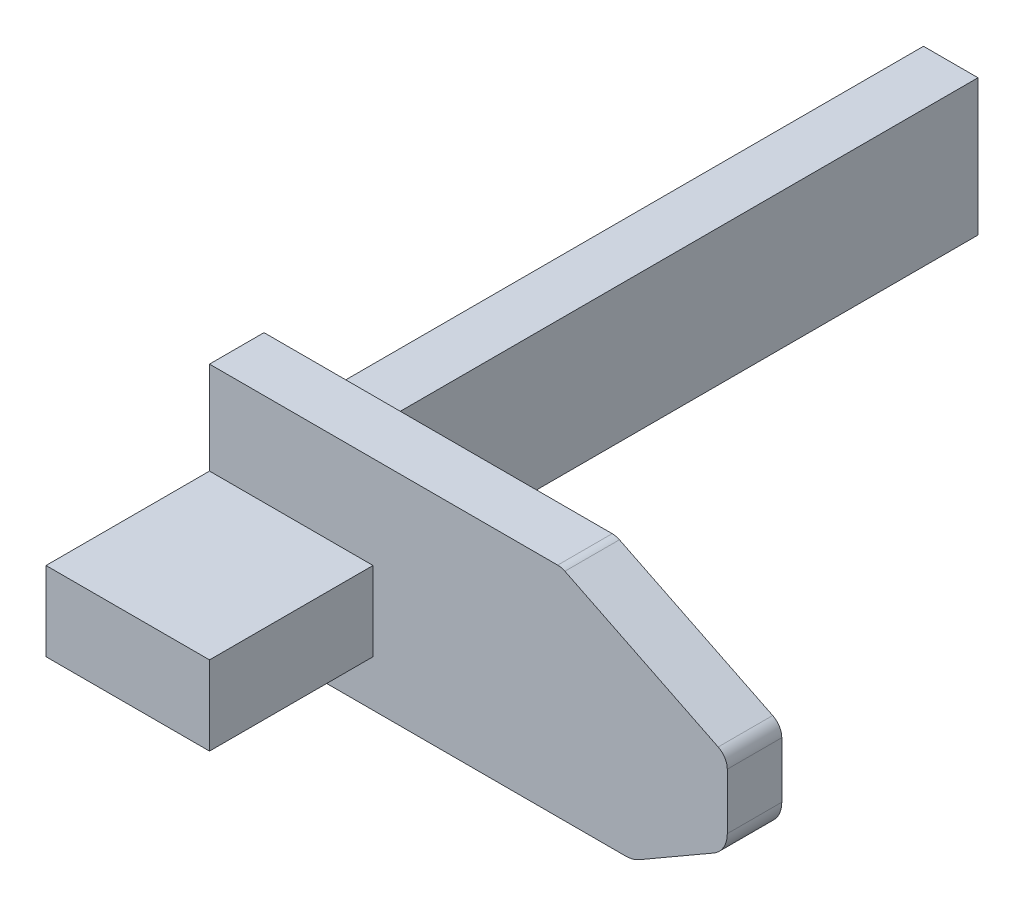
ISO-10303-21;
HEADER;
FILE_DESCRIPTION(('STEP AP214'),'2;1');
FILE_NAME('part.step','',(''),(''),'','','');
FILE_SCHEMA(('AUTOMOTIVE_DESIGN { 1 0 10303 214 1 1 1 1 }'));
ENDSEC;
DATA;
#1=APPLICATION_CONTEXT('core data for automotive mechanical design processes');
#2=APPLICATION_PROTOCOL_DEFINITION('international standard','automotive_design',2000,#1);
#3=PRODUCT_CONTEXT('',#1,'mechanical');
#4=PRODUCT('Part','Part','',(#3));
#5=PRODUCT_RELATED_PRODUCT_CATEGORY('part','',(#4));
#6=PRODUCT_DEFINITION_FORMATION('','',#4);
#7=PRODUCT_DEFINITION_CONTEXT('part definition',#1,'design');
#8=PRODUCT_DEFINITION('design','',#6,#7);
#9=PRODUCT_DEFINITION_SHAPE('','',#8);
#10=(LENGTH_UNIT() NAMED_UNIT(*) SI_UNIT(.MILLI.,.METRE.));
#11=(NAMED_UNIT(*) PLANE_ANGLE_UNIT() SI_UNIT($,.RADIAN.));
#12=(NAMED_UNIT(*) SI_UNIT($,.STERADIAN.) SOLID_ANGLE_UNIT());
#13=UNCERTAINTY_MEASURE_WITH_UNIT(LENGTH_MEASURE(1.E-05),#10,'distance_accuracy_value','');
#14=(GEOMETRIC_REPRESENTATION_CONTEXT(3) GLOBAL_UNCERTAINTY_ASSIGNED_CONTEXT((#13)) GLOBAL_UNIT_ASSIGNED_CONTEXT((#10,
#11,#12)) REPRESENTATION_CONTEXT('',''));
#15=CARTESIAN_POINT('',(0.,0.,0.));
#16=DIRECTION('',(0.,0.,1.));
#17=DIRECTION('',(1.,0.,0.));
#18=AXIS2_PLACEMENT_3D('',#15,#16,#17);
#19=CARTESIAN_POINT('',(0.,0.,10.));
#20=DIRECTION('',(0.,0.,1.));
#21=DIRECTION('',(-1.,0.,0.));
#22=AXIS2_PLACEMENT_3D('',#19,#20,#21);
#23=PLANE('',#22);
#24=DIRECTION('',(0.866025403784438,0.500000000000002,0.));
#25=VECTOR('',#24,1.);
#26=CARTESIAN_POINT('',(8.81238612142773,-15.2635004982276,10.));
#27=LINE('',#26,#25);
#28=CARTESIAN_POINT('',(19.8611544605813,-8.88449112340347,10.));
#29=VERTEX_POINT('',#28);
#30=CARTESIAN_POINT('',(6.20090042273692,-16.7712424693516,10.));
#31=VERTEX_POINT('',#30);
#32=EDGE_CURVE('E437',#29,#31,#27,.F.);
#33=ORIENTED_EDGE('',*,*,#32,.F.);
#34=CARTESIAN_POINT('',(17.3611544605813,-4.55436410448128,10.));
#35=DIRECTION('',(0.,0.,-1.));
#36=DIRECTION('',(-1.,0.,0.));
#37=AXIS2_PLACEMENT_3D('',#34,#35,#36);
#38=CIRCLE('',#37,5.);
#39=CARTESIAN_POINT('',(22.3611544605813,-4.55436410448128,10.));
#40=VERTEX_POINT('',#39);
#41=EDGE_CURVE('E449',#40,#29,#38,.T.);
#42=ORIENTED_EDGE('',*,*,#41,.F.);
#43=DIRECTION('',(0.,1.,0.));
#44=VECTOR('',#43,1.);
#45=CARTESIAN_POINT('',(22.3611544605813,-7.44111545042943,10.));
#46=LINE('',#45,#44);
#47=CARTESIAN_POINT('',(22.3611544605813,5.69336466936578,10.));
#48=VERTEX_POINT('',#47);
#49=EDGE_CURVE('E374',#40,#48,#46,.T.);
#50=ORIENTED_EDGE('',*,*,#49,.T.);
#51=CARTESIAN_POINT('',(19.3611544605813,5.69336466936578,10.));
#52=DIRECTION('',(0.,0.,-1.));
#53=DIRECTION('',(-1.,0.,0.));
#54=AXIS2_PLACEMENT_3D('',#51,#52,#53);
#55=CIRCLE('',#54,3.);
#56=CARTESIAN_POINT('',(20.6880205312383,8.38398289396384,10.));
#57=VERTEX_POINT('',#56);
#58=EDGE_CURVE('E416',#57,#48,#55,.T.);
#59=ORIENTED_EDGE('',*,*,#58,.F.);
#60=DIRECTION('',(0.896872741532688,-0.442288690219002,0.));
#61=VECTOR('',#60,1.);
#62=CARTESIAN_POINT('',(7.37270621157537,14.9503692468747,10.));
#63=LINE('',#62,#61);
#64=CARTESIAN_POINT('',(-7.42847239011065,22.2495027741686,10.));
#65=VERTEX_POINT('',#64);
#66=EDGE_CURVE('E403',#65,#57,#63,.T.);
#67=ORIENTED_EDGE('',*,*,#66,.F.);
#68=CARTESIAN_POINT('',(-8.75533846076766,19.5588845495706,10.));
#69=DIRECTION('',(0.,0.,-1.));
#70=DIRECTION('',(-1.,0.,0.));
#71=AXIS2_PLACEMENT_3D('',#68,#69,#70);
#72=CIRCLE('',#71,3.);
#73=CARTESIAN_POINT('',(-8.75533846076765,22.5588845495706,10.));
#74=VERTEX_POINT('',#73);
#75=EDGE_CURVE('E419',#74,#65,#72,.T.);
#76=ORIENTED_EDGE('',*,*,#75,.F.);
#77=DIRECTION('',(-1.,0.,0.));
#78=VECTOR('',#77,1.);
#79=CARTESIAN_POINT('',(22.3611544605813,22.5588845495706,10.));
#80=LINE('',#79,#78);
#81=CARTESIAN_POINT('',(-72.6388455394187,22.5588845495706,10.));
#82=VERTEX_POINT('',#81);
#83=EDGE_CURVE('E304',#74,#82,#80,.T.);
#84=ORIENTED_EDGE('',*,*,#83,.T.);
#85=DIRECTION('',(0.,-1.,0.));
#86=VECTOR('',#85,1.);
#87=CARTESIAN_POINT('',(-72.6388455394187,22.5588845495706,10.));
#88=LINE('',#87,#86);
#89=CARTESIAN_POINT('',(-72.6388455394187,5.55888454957057,10.));
#90=VERTEX_POINT('',#89);
#91=EDGE_CURVE('E294',#82,#90,#88,.T.);
#92=ORIENTED_EDGE('',*,*,#91,.T.);
#93=DIRECTION('',(1.,0.,0.));
#94=VECTOR('',#93,1.);
#95=CARTESIAN_POINT('',(-42.6388455394187,5.55888454957057,10.));
#96=LINE('',#95,#94);
#97=CARTESIAN_POINT('',(-42.6388455394187,5.55888454957057,10.));
#98=VERTEX_POINT('',#97);
#99=EDGE_CURVE('E258',#90,#98,#96,.T.);
#100=ORIENTED_EDGE('',*,*,#99,.T.);
#101=DIRECTION('',(0.,-1.,0.));
#102=VECTOR('',#101,1.);
#103=CARTESIAN_POINT('',(-42.6388455394187,5.55888454957057,10.));
#104=LINE('',#103,#102);
#105=CARTESIAN_POINT('',(-42.6388455394187,-8.94111545042943,10.));
#106=VERTEX_POINT('',#105);
#107=EDGE_CURVE('E245',#98,#106,#104,.T.);
#108=ORIENTED_EDGE('',*,*,#107,.T.);
#109=DIRECTION('',(-1.,0.,0.));
#110=VECTOR('',#109,1.);
#111=CARTESIAN_POINT('',(-72.6388455394187,-8.94111545042943,10.));
#112=LINE('',#111,#110);
#113=CARTESIAN_POINT('',(-72.6388455394187,-8.94111545042943,10.));
#114=VERTEX_POINT('',#113);
#115=EDGE_CURVE('E257',#106,#114,#112,.T.);
#116=ORIENTED_EDGE('',*,*,#115,.T.);
#117=CARTESIAN_POINT('',(-72.6388455394187,-17.4411154504294,10.));
#118=VERTEX_POINT('',#117);
#119=EDGE_CURVE('E249',#114,#118,#88,.T.);
#120=ORIENTED_EDGE('',*,*,#119,.T.);
#121=DIRECTION('',(1.,0.,0.));
#122=VECTOR('',#121,1.);
#123=CARTESIAN_POINT('',(22.3611544605813,-17.4411154504294,10.));
#124=LINE('',#123,#122);
#125=CARTESIAN_POINT('',(3.70090042273692,-17.4411154504294,10.));
#126=VERTEX_POINT('',#125);
#127=EDGE_CURVE('E313',#118,#126,#124,.T.);
#128=ORIENTED_EDGE('',*,*,#127,.T.);
#129=CARTESIAN_POINT('',(3.70090042273691,-12.4411154504294,10.));
#130=DIRECTION('',(0.,0.,-1.));
#131=DIRECTION('',(-1.,0.,0.));
#132=AXIS2_PLACEMENT_3D('',#129,#130,#131);
#133=CIRCLE('',#132,5.);
#134=EDGE_CURVE('E51',#31,#126,#133,.T.);
#135=ORIENTED_EDGE('',*,*,#134,.F.);
#136=EDGE_LOOP('',(#33,#42,#50,#59,#67,#76,#84,#92,#100,#108,#116,#120,#128,#135));
#137=FACE_BOUND('',#136,.T.);
#138=ADVANCED_FACE('F43',(#137),#23,.T.);
#139=CARTESIAN_POINT('',(0.,0.,0.));
#140=DIRECTION('',(0.,0.,1.));
#141=DIRECTION('',(-1.,0.,0.));
#142=AXIS2_PLACEMENT_3D('',#139,#140,#141);
#143=PLANE('',#142);
#144=DIRECTION('',(0.,-1.,0.));
#145=VECTOR('',#144,1.);
#146=CARTESIAN_POINT('',(-68.1388455394187,15.0588845495706,0.));
#147=LINE('',#146,#145);
#148=CARTESIAN_POINT('',(-68.1388455394187,-12.9411154504294,0.));
#149=VERTEX_POINT('',#148);
#150=CARTESIAN_POINT('',(-68.1388455394187,18.0588845495706,0.));
#151=VERTEX_POINT('',#150);
#152=EDGE_CURVE('E388',#149,#151,#147,.F.);
#153=ORIENTED_EDGE('',*,*,#152,.F.);
#154=DIRECTION('',(1.,0.,0.));
#155=VECTOR('',#154,1.);
#156=CARTESIAN_POINT('',(-65.1388455394187,-12.9411154504294,0.));
#157=LINE('',#156,#155);
#158=CARTESIAN_POINT('',(-52.1388455394187,-12.9411154504294,0.));
#159=VERTEX_POINT('',#158);
#160=EDGE_CURVE('E382',#159,#149,#157,.F.);
#161=ORIENTED_EDGE('',*,*,#160,.F.);
#162=DIRECTION('',(0.,1.,0.));
#163=VECTOR('',#162,1.);
#164=CARTESIAN_POINT('',(-52.1388455394187,-9.94111545042943,0.));
#165=LINE('',#164,#163);
#166=CARTESIAN_POINT('',(-52.1388455394187,18.0588845495706,0.));
#167=VERTEX_POINT('',#166);
#168=EDGE_CURVE('E385',#167,#159,#165,.F.);
#169=ORIENTED_EDGE('',*,*,#168,.F.);
#170=DIRECTION('',(-1.,0.,0.));
#171=VECTOR('',#170,1.);
#172=CARTESIAN_POINT('',(-55.1388455394187,18.0588845495706,0.));
#173=LINE('',#172,#171);
#174=EDGE_CURVE('E391',#151,#167,#173,.F.);
#175=ORIENTED_EDGE('',*,*,#174,.F.);
#176=EDGE_LOOP('',(#153,#161,#169,#175));
#177=FACE_BOUND('',#176,.T.);
#178=DIRECTION('',(-1.,0.,0.));
#179=VECTOR('',#178,1.);
#180=CARTESIAN_POINT('',(22.3611544605813,-17.4411154504294,0.));
#181=LINE('',#180,#179);
#182=CARTESIAN_POINT('',(3.70090042273692,-17.4411154504294,0.));
#183=VERTEX_POINT('',#182);
#184=CARTESIAN_POINT('',(-72.6388455394187,-17.4411154504294,0.));
#185=VERTEX_POINT('',#184);
#186=EDGE_CURVE('E310',#183,#185,#181,.T.);
#187=ORIENTED_EDGE('',*,*,#186,.T.);
#188=DIRECTION('',(0.,1.,0.));
#189=VECTOR('',#188,1.);
#190=CARTESIAN_POINT('',(-72.6388455394187,22.5588845495706,0.));
#191=LINE('',#190,#189);
#192=CARTESIAN_POINT('',(-72.6388455394187,22.5588845495706,0.));
#193=VERTEX_POINT('',#192);
#194=EDGE_CURVE('E299',#185,#193,#191,.T.);
#195=ORIENTED_EDGE('',*,*,#194,.T.);
#196=DIRECTION('',(1.,0.,0.));
#197=VECTOR('',#196,1.);
#198=CARTESIAN_POINT('',(22.3611544605813,22.5588845495706,0.));
#199=LINE('',#198,#197);
#200=CARTESIAN_POINT('',(-8.75533846076765,22.5588845495706,0.));
#201=VERTEX_POINT('',#200);
#202=EDGE_CURVE('E307',#193,#201,#199,.T.);
#203=ORIENTED_EDGE('',*,*,#202,.T.);
#204=CARTESIAN_POINT('',(-8.75533846076766,19.5588845495706,0.));
#205=DIRECTION('',(0.,0.,-1.));
#206=DIRECTION('',(-1.,0.,0.));
#207=AXIS2_PLACEMENT_3D('',#204,#205,#206);
#208=CIRCLE('',#207,3.);
#209=CARTESIAN_POINT('',(-7.42847239011065,22.2495027741686,0.));
#210=VERTEX_POINT('',#209);
#211=EDGE_CURVE('E429',#210,#201,#208,.F.);
#212=ORIENTED_EDGE('',*,*,#211,.F.);
#213=DIRECTION('',(-0.896872741532688,0.442288690219002,0.));
#214=VECTOR('',#213,1.);
#215=CARTESIAN_POINT('',(-8.05583656925706,22.5588845495706,0.));
#216=LINE('',#215,#214);
#217=CARTESIAN_POINT('',(20.6880205312383,8.38398289396384,0.));
#218=VERTEX_POINT('',#217);
#219=EDGE_CURVE('E411',#218,#210,#216,.T.);
#220=ORIENTED_EDGE('',*,*,#219,.F.);
#221=CARTESIAN_POINT('',(19.3611544605813,5.69336466936578,0.));
#222=DIRECTION('',(0.,0.,-1.));
#223=DIRECTION('',(-1.,0.,0.));
#224=AXIS2_PLACEMENT_3D('',#221,#222,#223);
#225=CIRCLE('',#224,3.);
#226=CARTESIAN_POINT('',(22.3611544605813,5.69336466936578,0.));
#227=VERTEX_POINT('',#226);
#228=EDGE_CURVE('E426',#227,#218,#225,.F.);
#229=ORIENTED_EDGE('',*,*,#228,.F.);
#230=DIRECTION('',(0.,1.,0.));
#231=VECTOR('',#230,1.);
#232=CARTESIAN_POINT('',(22.3611544605813,-7.44111545042943,0.));
#233=LINE('',#232,#231);
#234=CARTESIAN_POINT('',(22.3611544605813,-4.55436410448128,0.));
#235=VERTEX_POINT('',#234);
#236=EDGE_CURVE('E360',#235,#227,#233,.T.);
#237=ORIENTED_EDGE('',*,*,#236,.F.);
#238=CARTESIAN_POINT('',(17.3611544605813,-4.55436410448128,0.));
#239=DIRECTION('',(0.,0.,-1.));
#240=DIRECTION('',(-1.,0.,0.));
#241=AXIS2_PLACEMENT_3D('',#238,#239,#240);
#242=CIRCLE('',#241,5.);
#243=CARTESIAN_POINT('',(19.8611544605813,-8.88449112340347,0.));
#244=VERTEX_POINT('',#243);
#245=EDGE_CURVE('E442',#244,#235,#242,.F.);
#246=ORIENTED_EDGE('',*,*,#245,.F.);
#247=DIRECTION('',(-0.866025403784438,-0.500000000000002,0.));
#248=VECTOR('',#247,1.);
#249=CARTESIAN_POINT('',(5.04064638489253,-17.4411154504294,0.));
#250=LINE('',#249,#248);
#251=CARTESIAN_POINT('',(6.20090042273692,-16.7712424693516,0.));
#252=VERTEX_POINT('',#251);
#253=EDGE_CURVE('E434',#252,#244,#250,.F.);
#254=ORIENTED_EDGE('',*,*,#253,.F.);
#255=CARTESIAN_POINT('',(3.70090042273691,-12.4411154504294,0.));
#256=DIRECTION('',(0.,0.,-1.));
#257=DIRECTION('',(-1.,0.,0.));
#258=AXIS2_PLACEMENT_3D('',#255,#256,#257);
#259=CIRCLE('',#258,5.);
#260=EDGE_CURVE('E444',#183,#252,#259,.F.);
#261=ORIENTED_EDGE('',*,*,#260,.F.);
#262=EDGE_LOOP('',(#187,#195,#203,#212,#220,#229,#237,#246,#254,#261));
#263=FACE_BOUND('',#262,.T.);
#264=DIRECTION('',(0.987875892570632,-0.155245679095352,0.));
#265=VECTOR('',#264,1.);
#266=CARTESIAN_POINT('',(-16.8881141977384,-2.46968973142658,0.));
#267=LINE('',#266,#265);
#268=CARTESIAN_POINT('',(-16.8881141977384,-2.46968973142658,0.));
#269=VERTEX_POINT('',#268);
#270=CARTESIAN_POINT('',(-3.96862696659689,-4.5,0.));
#271=VERTEX_POINT('',#270);
#272=EDGE_CURVE('E338',#269,#271,#267,.T.);
#273=ORIENTED_EDGE('',*,*,#272,.T.);
#274=CARTESIAN_POINT('',(0.,0.,0.));
#275=DIRECTION('',(0.,0.,1.));
#276=DIRECTION('',(1.,0.,0.));
#277=AXIS2_PLACEMENT_3D('',#274,#275,#276);
#278=CIRCLE('',#277,6.00000000000001);
#279=CARTESIAN_POINT('',(3.96862696659689,-4.5,0.));
#280=VERTEX_POINT('',#279);
#281=EDGE_CURVE('E341',#271,#280,#278,.T.);
#282=ORIENTED_EDGE('',*,*,#281,.T.);
#283=DIRECTION('',(0.987875892570632,0.155245679095352,0.));
#284=VECTOR('',#283,1.);
#285=CARTESIAN_POINT('',(16.8881141977384,-2.46968973142658,0.));
#286=LINE('',#285,#284);
#287=CARTESIAN_POINT('',(16.8881141977384,-2.46968973142658,0.));
#288=VERTEX_POINT('',#287);
#289=EDGE_CURVE('E344',#280,#288,#286,.T.);
#290=ORIENTED_EDGE('',*,*,#289,.T.);
#291=CARTESIAN_POINT('',(16.5,0.,0.));
#292=DIRECTION('',(0.,0.,1.));
#293=DIRECTION('',(1.,0.,0.));
#294=AXIS2_PLACEMENT_3D('',#291,#292,#293);
#295=CIRCLE('',#294,2.5);
#296=CARTESIAN_POINT('',(16.8881141977384,2.46968973142658,0.));
#297=VERTEX_POINT('',#296);
#298=EDGE_CURVE('E347',#288,#297,#295,.T.);
#299=ORIENTED_EDGE('',*,*,#298,.T.);
#300=DIRECTION('',(-0.987875892570632,0.155245679095352,0.));
#301=VECTOR('',#300,1.);
#302=CARTESIAN_POINT('',(3.96862696659689,4.5,0.));
#303=LINE('',#302,#301);
#304=CARTESIAN_POINT('',(3.96862696659689,4.5,0.));
#305=VERTEX_POINT('',#304);
#306=EDGE_CURVE('E350',#297,#305,#303,.T.);
#307=ORIENTED_EDGE('',*,*,#306,.T.);
#308=CARTESIAN_POINT('',(0.,0.,0.));
#309=DIRECTION('',(0.,0.,1.));
#310=DIRECTION('',(-1.,0.,0.));
#311=AXIS2_PLACEMENT_3D('',#308,#309,#310);
#312=CIRCLE('',#311,6.00000000000002);
#313=CARTESIAN_POINT('',(-3.96862696659689,4.5,0.));
#314=VERTEX_POINT('',#313);
#315=EDGE_CURVE('E353',#305,#314,#312,.T.);
#316=ORIENTED_EDGE('',*,*,#315,.T.);
#317=DIRECTION('',(-0.987875892570632,-0.155245679095352,0.));
#318=VECTOR('',#317,1.);
#319=CARTESIAN_POINT('',(-16.8881141977384,2.46968973142658,0.));
#320=LINE('',#319,#318);
#321=CARTESIAN_POINT('',(-16.8881141977384,2.46968973142658,0.));
#322=VERTEX_POINT('',#321);
#323=EDGE_CURVE('E321',#314,#322,#320,.T.);
#324=ORIENTED_EDGE('',*,*,#323,.T.);
#325=CARTESIAN_POINT('',(-16.5,0.,0.));
#326=DIRECTION('',(0.,0.,1.));
#327=DIRECTION('',(1.,0.,0.));
#328=AXIS2_PLACEMENT_3D('',#325,#326,#327);
#329=CIRCLE('',#328,2.5);
#330=EDGE_CURVE('E316',#322,#269,#329,.T.);
#331=ORIENTED_EDGE('',*,*,#330,.T.);
#332=EDGE_LOOP('',(#273,#282,#290,#299,#307,#316,#324,#331));
#333=FACE_BOUND('',#332,.T.);
#334=ADVANCED_FACE('F460',(#177,#263,#333),#143,.F.);
#335=CARTESIAN_POINT('',(22.3611544605813,-7.44111545042943,10.));
#336=DIRECTION('',(1.,0.,0.));
#337=DIRECTION('',(0.,0.,1.));
#338=AXIS2_PLACEMENT_3D('',#335,#336,#337);
#339=PLANE('',#338);
#340=ORIENTED_EDGE('',*,*,#236,.T.);
#341=DIRECTION('',(0.,0.,-1.));
#342=VECTOR('',#341,1.);
#343=CARTESIAN_POINT('',(22.3611544605813,5.69336466936578,10.));
#344=LINE('',#343,#342);
#345=EDGE_CURVE('E432',#48,#227,#344,.T.);
#346=ORIENTED_EDGE('',*,*,#345,.F.);
#347=ORIENTED_EDGE('',*,*,#49,.F.);
#348=DIRECTION('',(0.,0.,-1.));
#349=VECTOR('',#348,1.);
#350=CARTESIAN_POINT('',(22.3611544605813,-4.55436410448128,10.));
#351=LINE('',#350,#349);
#352=EDGE_CURVE('E11',#235,#40,#351,.F.);
#353=ORIENTED_EDGE('',*,*,#352,.F.);
#354=EDGE_LOOP('',(#340,#346,#347,#353));
#355=FACE_BOUND('',#354,.T.);
#356=ADVANCED_FACE('F472',(#355),#339,.T.);
#357=CARTESIAN_POINT('',(-16.5,0.,2.5));
#358=DIRECTION('',(0.,0.,-1.));
#359=DIRECTION('',(1.,0.,0.));
#360=AXIS2_PLACEMENT_3D('',#357,#358,#359);
#361=CYLINDRICAL_SURFACE('',#360,2.5);
#362=ORIENTED_EDGE('',*,*,#330,.F.);
#363=DIRECTION('',(0.,0.,-1.));
#364=VECTOR('',#363,1.);
#365=CARTESIAN_POINT('',(-16.8881141977384,2.46968973142658,2.5));
#366=LINE('',#365,#364);
#367=CARTESIAN_POINT('',(-16.8881141977384,2.46968973142658,2.5));
#368=VERTEX_POINT('',#367);
#369=EDGE_CURVE('E358',#368,#322,#366,.T.);
#370=ORIENTED_EDGE('',*,*,#369,.F.);
#371=CARTESIAN_POINT('',(-16.5,0.,2.5));
#372=DIRECTION('',(0.,0.,1.));
#373=DIRECTION('',(1.,0.,0.));
#374=AXIS2_PLACEMENT_3D('',#371,#372,#373);
#375=CIRCLE('',#374,2.5);
#376=CARTESIAN_POINT('',(-16.8881141977384,-2.46968973142658,2.5));
#377=VERTEX_POINT('',#376);
#378=EDGE_CURVE('E317',#368,#377,#375,.T.);
#379=ORIENTED_EDGE('',*,*,#378,.T.);
#380=DIRECTION('',(0.,0.,-1.));
#381=VECTOR('',#380,1.);
#382=CARTESIAN_POINT('',(-16.8881141977384,-2.46968973142658,2.5));
#383=LINE('',#382,#381);
#384=EDGE_CURVE('E335',#377,#269,#383,.T.);
#385=ORIENTED_EDGE('',*,*,#384,.T.);
#386=EDGE_LOOP('',(#362,#370,#379,#385));
#387=FACE_BOUND('',#386,.T.);
#388=ADVANCED_FACE('F511',(#387),#361,.F.);
#389=CARTESIAN_POINT('',(-16.8881141977384,2.46968973142658,2.5));
#390=DIRECTION('',(-0.155245679095352,0.987875892570632,0.));
#391=DIRECTION('',(-0.987875892570632,-0.155245679095352,0.));
#392=AXIS2_PLACEMENT_3D('',#389,#390,#391);
#393=PLANE('',#392);
#394=ORIENTED_EDGE('',*,*,#323,.F.);
#395=DIRECTION('',(0.,0.,-1.));
#396=VECTOR('',#395,1.);
#397=CARTESIAN_POINT('',(-3.96862696659689,4.5,2.5));
#398=LINE('',#397,#396);
#399=CARTESIAN_POINT('',(-3.96862696659689,4.5,2.5));
#400=VERTEX_POINT('',#399);
#401=EDGE_CURVE('E361',#400,#314,#398,.T.);
#402=ORIENTED_EDGE('',*,*,#401,.F.);
#403=DIRECTION('',(-0.987875892570632,-0.155245679095352,0.));
#404=VECTOR('',#403,1.);
#405=CARTESIAN_POINT('',(-16.8881141977384,2.46968973142658,2.5));
#406=LINE('',#405,#404);
#407=EDGE_CURVE('E333',#400,#368,#406,.T.);
#408=ORIENTED_EDGE('',*,*,#407,.T.);
#409=ORIENTED_EDGE('',*,*,#369,.T.);
#410=EDGE_LOOP('',(#394,#402,#408,#409));
#411=FACE_BOUND('',#410,.T.);
#412=ADVANCED_FACE('F766',(#411),#393,.F.);
#413=CARTESIAN_POINT('',(0.,0.,2.5));
#414=DIRECTION('',(0.,0.,-1.));
#415=DIRECTION('',(1.,0.,0.));
#416=AXIS2_PLACEMENT_3D('',#413,#414,#415);
#417=CYLINDRICAL_SURFACE('',#416,6.00000000000002);
#418=ORIENTED_EDGE('',*,*,#315,.F.);
#419=DIRECTION('',(0.,0.,-1.));
#420=VECTOR('',#419,1.);
#421=CARTESIAN_POINT('',(3.96862696659689,4.5,2.5));
#422=LINE('',#421,#420);
#423=CARTESIAN_POINT('',(3.96862696659689,4.5,2.5));
#424=VERTEX_POINT('',#423);
#425=EDGE_CURVE('E363',#424,#305,#422,.T.);
#426=ORIENTED_EDGE('',*,*,#425,.F.);
#427=CARTESIAN_POINT('',(0.,0.,2.5));
#428=DIRECTION('',(0.,0.,1.));
#429=DIRECTION('',(-1.,0.,0.));
#430=AXIS2_PLACEMENT_3D('',#427,#428,#429);
#431=CIRCLE('',#430,6.00000000000002);
#432=EDGE_CURVE('E331',#424,#400,#431,.T.);
#433=ORIENTED_EDGE('',*,*,#432,.T.);
#434=ORIENTED_EDGE('',*,*,#401,.T.);
#435=EDGE_LOOP('',(#418,#426,#433,#434));
#436=FACE_BOUND('',#435,.T.);
#437=ADVANCED_FACE('F757',(#436),#417,.F.);
#438=CARTESIAN_POINT('',(3.96862696659689,4.5,2.5));
#439=DIRECTION('',(0.155245679095352,0.987875892570632,0.));
#440=DIRECTION('',(-0.987875892570632,0.155245679095352,0.));
#441=AXIS2_PLACEMENT_3D('',#438,#439,#440);
#442=PLANE('',#441);
#443=ORIENTED_EDGE('',*,*,#306,.F.);
#444=DIRECTION('',(0.,0.,-1.));
#445=VECTOR('',#444,1.);
#446=CARTESIAN_POINT('',(16.8881141977384,2.46968973142658,2.5));
#447=LINE('',#446,#445);
#448=CARTESIAN_POINT('',(16.8881141977384,2.46968973142658,2.5));
#449=VERTEX_POINT('',#448);
#450=EDGE_CURVE('E365',#449,#297,#447,.T.);
#451=ORIENTED_EDGE('',*,*,#450,.F.);
#452=DIRECTION('',(-0.987875892570632,0.155245679095352,0.));
#453=VECTOR('',#452,1.);
#454=CARTESIAN_POINT('',(3.96862696659689,4.5,2.5));
#455=LINE('',#454,#453);
#456=EDGE_CURVE('E329',#449,#424,#455,.T.);
#457=ORIENTED_EDGE('',*,*,#456,.T.);
#458=ORIENTED_EDGE('',*,*,#425,.T.);
#459=EDGE_LOOP('',(#443,#451,#457,#458));
#460=FACE_BOUND('',#459,.T.);
#461=ADVANCED_FACE('F748',(#460),#442,.F.);
#462=CARTESIAN_POINT('',(16.5,0.,2.5));
#463=DIRECTION('',(0.,0.,-1.));
#464=DIRECTION('',(1.,0.,0.));
#465=AXIS2_PLACEMENT_3D('',#462,#463,#464);
#466=CYLINDRICAL_SURFACE('',#465,2.5);
#467=ORIENTED_EDGE('',*,*,#298,.F.);
#468=DIRECTION('',(0.,0.,-1.));
#469=VECTOR('',#468,1.);
#470=CARTESIAN_POINT('',(16.8881141977384,-2.46968973142658,2.5));
#471=LINE('',#470,#469);
#472=CARTESIAN_POINT('',(16.8881141977384,-2.46968973142658,2.5));
#473=VERTEX_POINT('',#472);
#474=EDGE_CURVE('E367',#473,#288,#471,.T.);
#475=ORIENTED_EDGE('',*,*,#474,.F.);
#476=CARTESIAN_POINT('',(16.5,0.,2.5));
#477=DIRECTION('',(0.,0.,1.));
#478=DIRECTION('',(1.,0.,0.));
#479=AXIS2_PLACEMENT_3D('',#476,#477,#478);
#480=CIRCLE('',#479,2.5);
#481=EDGE_CURVE('E327',#473,#449,#480,.T.);
#482=ORIENTED_EDGE('',*,*,#481,.T.);
#483=ORIENTED_EDGE('',*,*,#450,.T.);
#484=EDGE_LOOP('',(#467,#475,#482,#483));
#485=FACE_BOUND('',#484,.T.);
#486=ADVANCED_FACE('F739',(#485),#466,.F.);
#487=CARTESIAN_POINT('',(16.8881141977384,-2.46968973142658,2.5));
#488=DIRECTION('',(0.155245679095352,-0.987875892570632,0.));
#489=DIRECTION('',(0.987875892570632,0.155245679095352,0.));
#490=AXIS2_PLACEMENT_3D('',#487,#488,#489);
#491=PLANE('',#490);
#492=ORIENTED_EDGE('',*,*,#289,.F.);
#493=DIRECTION('',(0.,0.,-1.));
#494=VECTOR('',#493,1.);
#495=CARTESIAN_POINT('',(3.96862696659689,-4.5,2.5));
#496=LINE('',#495,#494);
#497=CARTESIAN_POINT('',(3.96862696659689,-4.5,2.5));
#498=VERTEX_POINT('',#497);
#499=EDGE_CURVE('E369',#498,#280,#496,.T.);
#500=ORIENTED_EDGE('',*,*,#499,.F.);
#501=DIRECTION('',(0.987875892570632,0.155245679095352,0.));
#502=VECTOR('',#501,1.);
#503=CARTESIAN_POINT('',(16.8881141977384,-2.46968973142658,2.5));
#504=LINE('',#503,#502);
#505=EDGE_CURVE('E325',#498,#473,#504,.T.);
#506=ORIENTED_EDGE('',*,*,#505,.T.);
#507=ORIENTED_EDGE('',*,*,#474,.T.);
#508=EDGE_LOOP('',(#492,#500,#506,#507));
#509=FACE_BOUND('',#508,.T.);
#510=ADVANCED_FACE('F730',(#509),#491,.F.);
#511=CARTESIAN_POINT('',(0.,0.,2.5));
#512=DIRECTION('',(0.,0.,-1.));
#513=DIRECTION('',(1.,0.,0.));
#514=AXIS2_PLACEMENT_3D('',#511,#512,#513);
#515=CYLINDRICAL_SURFACE('',#514,6.00000000000001);
#516=ORIENTED_EDGE('',*,*,#281,.F.);
#517=DIRECTION('',(0.,0.,-1.));
#518=VECTOR('',#517,1.);
#519=CARTESIAN_POINT('',(-3.96862696659689,-4.5,2.5));
#520=LINE('',#519,#518);
#521=CARTESIAN_POINT('',(-3.96862696659689,-4.5,2.5));
#522=VERTEX_POINT('',#521);
#523=EDGE_CURVE('E371',#522,#271,#520,.T.);
#524=ORIENTED_EDGE('',*,*,#523,.F.);
#525=CARTESIAN_POINT('',(0.,0.,2.5));
#526=DIRECTION('',(0.,0.,1.));
#527=DIRECTION('',(1.,0.,0.));
#528=AXIS2_PLACEMENT_3D('',#525,#526,#527);
#529=CIRCLE('',#528,6.00000000000001);
#530=EDGE_CURVE('E323',#522,#498,#529,.T.);
#531=ORIENTED_EDGE('',*,*,#530,.T.);
#532=ORIENTED_EDGE('',*,*,#499,.T.);
#533=EDGE_LOOP('',(#516,#524,#531,#532));
#534=FACE_BOUND('',#533,.T.);
#535=ADVANCED_FACE('F722',(#534),#515,.F.);
#536=CARTESIAN_POINT('',(-16.8881141977384,-2.46968973142658,2.5));
#537=DIRECTION('',(-0.155245679095352,-0.987875892570632,0.));
#538=DIRECTION('',(0.987875892570632,-0.155245679095352,0.));
#539=AXIS2_PLACEMENT_3D('',#536,#537,#538);
#540=PLANE('',#539);
#541=ORIENTED_EDGE('',*,*,#272,.F.);
#542=ORIENTED_EDGE('',*,*,#384,.F.);
#543=DIRECTION('',(0.987875892570632,-0.155245679095352,0.));
#544=VECTOR('',#543,1.);
#545=CARTESIAN_POINT('',(-16.8881141977384,-2.46968973142658,2.5));
#546=LINE('',#545,#544);
#547=EDGE_CURVE('E320',#377,#522,#546,.T.);
#548=ORIENTED_EDGE('',*,*,#547,.T.);
#549=ORIENTED_EDGE('',*,*,#523,.T.);
#550=EDGE_LOOP('',(#541,#542,#548,#549));
#551=FACE_BOUND('',#550,.T.);
#552=ADVANCED_FACE('F713',(#551),#540,.F.);
#553=CARTESIAN_POINT('',(-16.5,0.,2.5));
#554=DIRECTION('',(0.,0.,-1.));
#555=DIRECTION('',(1.,0.,0.));
#556=AXIS2_PLACEMENT_3D('',#553,#554,#555);
#557=PLANE('',#556);
#558=ORIENTED_EDGE('',*,*,#378,.F.);
#559=ORIENTED_EDGE('',*,*,#407,.F.);
#560=ORIENTED_EDGE('',*,*,#432,.F.);
#561=ORIENTED_EDGE('',*,*,#456,.F.);
#562=ORIENTED_EDGE('',*,*,#481,.F.);
#563=ORIENTED_EDGE('',*,*,#505,.F.);
#564=ORIENTED_EDGE('',*,*,#530,.F.);
#565=ORIENTED_EDGE('',*,*,#547,.F.);
#566=EDGE_LOOP('',(#558,#559,#560,#561,#562,#563,#564,#565));
#567=FACE_BOUND('',#566,.T.);
#568=ADVANCED_FACE('F705',(#567),#557,.T.);
#569=CARTESIAN_POINT('',(0.,-17.4411154504294,0.));
#570=DIRECTION('',(0.,-1.,0.));
#571=DIRECTION('',(1.,0.,0.));
#572=AXIS2_PLACEMENT_3D('',#569,#570,#571);
#573=PLANE('',#572);
#574=ORIENTED_EDGE('',*,*,#127,.F.);
#575=DIRECTION('',(0.,0.,-1.));
#576=VECTOR('',#575,1.);
#577=CARTESIAN_POINT('',(-72.6388455394187,-17.4411154504294,10.));
#578=LINE('',#577,#576);
#579=EDGE_CURVE('E297',#118,#185,#578,.T.);
#580=ORIENTED_EDGE('',*,*,#579,.T.);
#581=ORIENTED_EDGE('',*,*,#186,.F.);
#582=DIRECTION('',(0.,0.,1.));
#583=VECTOR('',#582,1.);
#584=CARTESIAN_POINT('',(3.70090042273691,-17.4411154504294,0.));
#585=LINE('',#584,#583);
#586=EDGE_CURVE('E440',#126,#183,#585,.F.);
#587=ORIENTED_EDGE('',*,*,#586,.F.);
#588=EDGE_LOOP('',(#574,#580,#581,#587));
#589=FACE_BOUND('',#588,.T.);
#590=ADVANCED_FACE('F456',(#589),#573,.T.);
#591=CARTESIAN_POINT('',(0.,22.5588845495706,0.));
#592=DIRECTION('',(0.,-1.,0.));
#593=DIRECTION('',(0.,0.,1.));
#594=AXIS2_PLACEMENT_3D('',#591,#592,#593);
#595=PLANE('',#594);
#596=ORIENTED_EDGE('',*,*,#202,.F.);
#597=DIRECTION('',(0.,0.,1.));
#598=VECTOR('',#597,1.);
#599=CARTESIAN_POINT('',(-72.6388455394187,22.5588845495706,10.));
#600=LINE('',#599,#598);
#601=EDGE_CURVE('E302',#193,#82,#600,.T.);
#602=ORIENTED_EDGE('',*,*,#601,.T.);
#603=ORIENTED_EDGE('',*,*,#83,.F.);
#604=DIRECTION('',(0.,0.,1.));
#605=VECTOR('',#604,1.);
#606=CARTESIAN_POINT('',(-8.75533846076766,22.5588845495706,10.));
#607=LINE('',#606,#605);
#608=EDGE_CURVE('E414',#201,#74,#607,.T.);
#609=ORIENTED_EDGE('',*,*,#608,.F.);
#610=EDGE_LOOP('',(#596,#602,#603,#609));
#611=FACE_BOUND('',#610,.T.);
#612=ADVANCED_FACE('F485',(#611),#595,.F.);
#613=CARTESIAN_POINT('',(-72.6388455394187,0.,0.));
#614=DIRECTION('',(-1.,0.,0.));
#615=DIRECTION('',(0.,0.,-1.));
#616=AXIS2_PLACEMENT_3D('',#613,#614,#615);
#617=PLANE('',#616);
#618=DIRECTION('',(0.,0.,1.));
#619=VECTOR('',#618,1.);
#620=CARTESIAN_POINT('',(-72.6388455394187,-8.94111545042943,10.));
#621=LINE('',#620,#619);
#622=CARTESIAN_POINT('',(-72.6388455394187,-8.94111545042943,40.));
#623=VERTEX_POINT('',#622);
#624=EDGE_CURVE('E232',#114,#623,#621,.T.);
#625=ORIENTED_EDGE('',*,*,#624,.T.);
#626=DIRECTION('',(0.,1.,0.));
#627=VECTOR('',#626,1.);
#628=CARTESIAN_POINT('',(-72.6388455394187,5.55888454957057,40.));
#629=LINE('',#628,#627);
#630=CARTESIAN_POINT('',(-72.6388455394187,5.55888454957057,40.));
#631=VERTEX_POINT('',#630);
#632=EDGE_CURVE('E239',#623,#631,#629,.T.);
#633=ORIENTED_EDGE('',*,*,#632,.T.);
#634=DIRECTION('',(0.,0.,-1.));
#635=VECTOR('',#634,1.);
#636=CARTESIAN_POINT('',(-72.6388455394187,5.55888454957057,40.));
#637=LINE('',#636,#635);
#638=EDGE_CURVE('E269',#631,#90,#637,.T.);
#639=ORIENTED_EDGE('',*,*,#638,.T.);
#640=ORIENTED_EDGE('',*,*,#91,.F.);
#641=ORIENTED_EDGE('',*,*,#601,.F.);
#642=ORIENTED_EDGE('',*,*,#194,.F.);
#643=ORIENTED_EDGE('',*,*,#579,.F.);
#644=ORIENTED_EDGE('',*,*,#119,.F.);
#645=EDGE_LOOP('',(#625,#633,#639,#640,#641,#642,#643,#644));
#646=FACE_BOUND('',#645,.T.);
#647=ADVANCED_FACE('F247',(#646),#617,.T.);
#648=CARTESIAN_POINT('',(-65.1388455394187,15.0588845495706,-113.5));
#649=DIRECTION('',(1.,0.,0.));
#650=DIRECTION('',(0.,0.,1.));
#651=AXIS2_PLACEMENT_3D('',#648,#649,#650);
#652=PLANE('',#651);
#653=DIRECTION('',(0.,0.,1.));
#654=VECTOR('',#653,1.);
#655=CARTESIAN_POINT('',(-65.1388455394187,15.0588845495706,-113.5));
#656=LINE('',#655,#654);
#657=CARTESIAN_POINT('',(-65.1388455394187,15.0588845495706,-113.5));
#658=VERTEX_POINT('',#657);
#659=CARTESIAN_POINT('',(-65.1388455394187,15.0588845495706,-3.00000000000003));
#660=VERTEX_POINT('',#659);
#661=EDGE_CURVE('E282',#658,#660,#656,.T.);
#662=ORIENTED_EDGE('',*,*,#661,.F.);
#663=DIRECTION('',(0.,-1.,0.));
#664=VECTOR('',#663,1.);
#665=CARTESIAN_POINT('',(-65.1388455394187,15.0588845495706,-113.5));
#666=LINE('',#665,#664);
#667=CARTESIAN_POINT('',(-65.1388455394187,-9.94111545042943,-113.5));
#668=VERTEX_POINT('',#667);
#669=EDGE_CURVE('E271',#658,#668,#666,.T.);
#670=ORIENTED_EDGE('',*,*,#669,.T.);
#671=DIRECTION('',(0.,0.,1.));
#672=VECTOR('',#671,1.);
#673=CARTESIAN_POINT('',(-65.1388455394187,-9.94111545042943,-113.5));
#674=LINE('',#673,#672);
#675=CARTESIAN_POINT('',(-65.1388455394187,-9.94111545042943,-3.00000000000003));
#676=VERTEX_POINT('',#675);
#677=EDGE_CURVE('E291',#668,#676,#674,.T.);
#678=ORIENTED_EDGE('',*,*,#677,.T.);
#679=DIRECTION('',(0.,-1.,0.));
#680=VECTOR('',#679,1.);
#681=CARTESIAN_POINT('',(-65.1388455394187,-9.94111545042943,-3.));
#682=LINE('',#681,#680);
#683=EDGE_CURVE('E394',#660,#676,#682,.T.);
#684=ORIENTED_EDGE('',*,*,#683,.F.);
#685=EDGE_LOOP('',(#662,#670,#678,#684));
#686=FACE_BOUND('',#685,.T.);
#687=ADVANCED_FACE('F670',(#686),#652,.F.);
#688=CARTESIAN_POINT('',(-65.1388455394187,-9.94111545042943,-113.5));
#689=DIRECTION('',(0.,1.,0.));
#690=DIRECTION('',(0.,0.,-1.));
#691=AXIS2_PLACEMENT_3D('',#688,#689,#690);
#692=PLANE('',#691);
#693=ORIENTED_EDGE('',*,*,#677,.F.);
#694=DIRECTION('',(1.,0.,0.));
#695=VECTOR('',#694,1.);
#696=CARTESIAN_POINT('',(-65.1388455394187,-9.94111545042943,-113.5));
#697=LINE('',#696,#695);
#698=CARTESIAN_POINT('',(-55.1388455394187,-9.94111545042943,-113.5));
#699=VERTEX_POINT('',#698);
#700=EDGE_CURVE('E274',#668,#699,#697,.T.);
#701=ORIENTED_EDGE('',*,*,#700,.T.);
#702=DIRECTION('',(0.,0.,1.));
#703=VECTOR('',#702,1.);
#704=CARTESIAN_POINT('',(-55.1388455394187,-9.94111545042943,-113.5));
#705=LINE('',#704,#703);
#706=CARTESIAN_POINT('',(-55.1388455394187,-9.94111545042943,-3.00000000000003));
#707=VERTEX_POINT('',#706);
#708=EDGE_CURVE('E288',#699,#707,#705,.T.);
#709=ORIENTED_EDGE('',*,*,#708,.T.);
#710=DIRECTION('',(1.,0.,0.));
#711=VECTOR('',#710,1.);
#712=CARTESIAN_POINT('',(-55.1388455394187,-9.94111545042943,-3.));
#713=LINE('',#712,#711);
#714=EDGE_CURVE('E400',#676,#707,#713,.T.);
#715=ORIENTED_EDGE('',*,*,#714,.F.);
#716=EDGE_LOOP('',(#693,#701,#709,#715));
#717=FACE_BOUND('',#716,.T.);
#718=ADVANCED_FACE('F660',(#717),#692,.F.);
#719=CARTESIAN_POINT('',(-55.1388455394187,15.0588845495706,-113.5));
#720=DIRECTION('',(-1.,0.,0.));
#721=DIRECTION('',(0.,0.,-1.));
#722=AXIS2_PLACEMENT_3D('',#719,#720,#721);
#723=PLANE('',#722);
#724=ORIENTED_EDGE('',*,*,#708,.F.);
#725=DIRECTION('',(0.,1.,0.));
#726=VECTOR('',#725,1.);
#727=CARTESIAN_POINT('',(-55.1388455394187,15.0588845495706,-113.5));
#728=LINE('',#727,#726);
#729=CARTESIAN_POINT('',(-55.1388455394187,15.0588845495706,-113.5));
#730=VERTEX_POINT('',#729);
#731=EDGE_CURVE('E277',#699,#730,#728,.T.);
#732=ORIENTED_EDGE('',*,*,#731,.T.);
#733=DIRECTION('',(0.,0.,1.));
#734=VECTOR('',#733,1.);
#735=CARTESIAN_POINT('',(-55.1388455394187,15.0588845495706,-113.5));
#736=LINE('',#735,#734);
#737=CARTESIAN_POINT('',(-55.1388455394187,15.0588845495706,-3.00000000000003));
#738=VERTEX_POINT('',#737);
#739=EDGE_CURVE('E285',#730,#738,#736,.T.);
#740=ORIENTED_EDGE('',*,*,#739,.T.);
#741=DIRECTION('',(0.,1.,0.));
#742=VECTOR('',#741,1.);
#743=CARTESIAN_POINT('',(-55.1388455394187,15.0588845495706,-3.));
#744=LINE('',#743,#742);
#745=EDGE_CURVE('E397',#707,#738,#744,.T.);
#746=ORIENTED_EDGE('',*,*,#745,.F.);
#747=EDGE_LOOP('',(#724,#732,#740,#746));
#748=FACE_BOUND('',#747,.T.);
#749=ADVANCED_FACE('F650',(#748),#723,.F.);
#750=CARTESIAN_POINT('',(-65.1388455394187,15.0588845495706,-113.5));
#751=DIRECTION('',(0.,-1.,0.));
#752=DIRECTION('',(0.,0.,1.));
#753=AXIS2_PLACEMENT_3D('',#750,#751,#752);
#754=PLANE('',#753);
#755=ORIENTED_EDGE('',*,*,#739,.F.);
#756=DIRECTION('',(-1.,0.,0.));
#757=VECTOR('',#756,1.);
#758=CARTESIAN_POINT('',(-65.1388455394187,15.0588845495706,-113.5));
#759=LINE('',#758,#757);
#760=EDGE_CURVE('E280',#730,#658,#759,.T.);
#761=ORIENTED_EDGE('',*,*,#760,.T.);
#762=ORIENTED_EDGE('',*,*,#661,.T.);
#763=DIRECTION('',(-1.,0.,0.));
#764=VECTOR('',#763,1.);
#765=CARTESIAN_POINT('',(-65.1388455394187,15.0588845495706,-3.));
#766=LINE('',#765,#764);
#767=EDGE_CURVE('E377',#738,#660,#766,.T.);
#768=ORIENTED_EDGE('',*,*,#767,.F.);
#769=EDGE_LOOP('',(#755,#761,#762,#768));
#770=FACE_BOUND('',#769,.T.);
#771=ADVANCED_FACE('F640',(#770),#754,.F.);
#772=CARTESIAN_POINT('',(0.,0.,-113.5));
#773=DIRECTION('',(0.,0.,-1.));
#774=DIRECTION('',(1.,0.,0.));
#775=AXIS2_PLACEMENT_3D('',#772,#773,#774);
#776=PLANE('',#775);
#777=ORIENTED_EDGE('',*,*,#669,.F.);
#778=ORIENTED_EDGE('',*,*,#760,.F.);
#779=ORIENTED_EDGE('',*,*,#731,.F.);
#780=ORIENTED_EDGE('',*,*,#700,.F.);
#781=EDGE_LOOP('',(#777,#778,#779,#780));
#782=FACE_BOUND('',#781,.T.);
#783=ADVANCED_FACE('F501',(#782),#776,.T.);
#784=CARTESIAN_POINT('',(-42.6388455394187,5.55888454957057,40.));
#785=DIRECTION('',(0.,-1.,0.));
#786=DIRECTION('',(0.,0.,1.));
#787=AXIS2_PLACEMENT_3D('',#784,#785,#786);
#788=PLANE('',#787);
#789=ORIENTED_EDGE('',*,*,#99,.F.);
#790=ORIENTED_EDGE('',*,*,#638,.F.);
#791=DIRECTION('',(1.,0.,0.));
#792=VECTOR('',#791,1.);
#793=CARTESIAN_POINT('',(-42.6388455394187,5.55888454957057,40.));
#794=LINE('',#793,#792);
#795=CARTESIAN_POINT('',(-42.6388455394187,5.55888454957057,40.));
#796=VERTEX_POINT('',#795);
#797=EDGE_CURVE('E242',#631,#796,#794,.T.);
#798=ORIENTED_EDGE('',*,*,#797,.T.);
#799=DIRECTION('',(0.,0.,-1.));
#800=VECTOR('',#799,1.);
#801=CARTESIAN_POINT('',(-42.6388455394187,5.55888454957057,40.));
#802=LINE('',#801,#800);
#803=EDGE_CURVE('E263',#796,#98,#802,.T.);
#804=ORIENTED_EDGE('',*,*,#803,.T.);
#805=EDGE_LOOP('',(#789,#790,#798,#804));
#806=FACE_BOUND('',#805,.T.);
#807=ADVANCED_FACE('F489',(#806),#788,.F.);
#808=CARTESIAN_POINT('',(-42.6388455394187,5.55888454957057,40.));
#809=DIRECTION('',(-1.,0.,0.));
#810=DIRECTION('',(0.,0.,-1.));
#811=AXIS2_PLACEMENT_3D('',#808,#809,#810);
#812=PLANE('',#811);
#813=ORIENTED_EDGE('',*,*,#107,.F.);
#814=ORIENTED_EDGE('',*,*,#803,.F.);
#815=DIRECTION('',(0.,-1.,0.));
#816=VECTOR('',#815,1.);
#817=CARTESIAN_POINT('',(-42.6388455394187,5.55888454957057,40.));
#818=LINE('',#817,#816);
#819=CARTESIAN_POINT('',(-42.6388455394187,-8.94111545042943,40.));
#820=VERTEX_POINT('',#819);
#821=EDGE_CURVE('E261',#796,#820,#818,.T.);
#822=ORIENTED_EDGE('',*,*,#821,.T.);
#823=DIRECTION('',(0.,0.,-1.));
#824=VECTOR('',#823,1.);
#825=CARTESIAN_POINT('',(-42.6388455394187,-8.94111545042943,10.));
#826=LINE('',#825,#824);
#827=EDGE_CURVE('E234',#820,#106,#826,.T.);
#828=ORIENTED_EDGE('',*,*,#827,.T.);
#829=EDGE_LOOP('',(#813,#814,#822,#828));
#830=FACE_BOUND('',#829,.T.);
#831=ADVANCED_FACE('F493',(#830),#812,.F.);
#832=CARTESIAN_POINT('',(0.,0.,40.));
#833=DIRECTION('',(0.,0.,1.));
#834=DIRECTION('',(-1.,0.,0.));
#835=AXIS2_PLACEMENT_3D('',#832,#833,#834);
#836=PLANE('',#835);
#837=ORIENTED_EDGE('',*,*,#632,.F.);
#838=DIRECTION('',(1.,0.,0.));
#839=VECTOR('',#838,1.);
#840=CARTESIAN_POINT('',(-72.6388455394187,-8.94111545042943,40.));
#841=LINE('',#840,#839);
#842=EDGE_CURVE('E227',#623,#820,#841,.T.);
#843=ORIENTED_EDGE('',*,*,#842,.T.);
#844=ORIENTED_EDGE('',*,*,#821,.F.);
#845=ORIENTED_EDGE('',*,*,#797,.F.);
#846=EDGE_LOOP('',(#837,#843,#844,#845));
#847=FACE_BOUND('',#846,.T.);
#848=ADVANCED_FACE('F240',(#847),#836,.T.);
#849=CARTESIAN_POINT('',(0.,-8.94111545042943,0.));
#850=DIRECTION('',(0.,-1.,0.));
#851=DIRECTION('',(0.,0.,1.));
#852=AXIS2_PLACEMENT_3D('',#849,#850,#851);
#853=PLANE('',#852);
#854=ORIENTED_EDGE('',*,*,#624,.F.);
#855=ORIENTED_EDGE('',*,*,#115,.F.);
#856=ORIENTED_EDGE('',*,*,#827,.F.);
#857=ORIENTED_EDGE('',*,*,#842,.F.);
#858=EDGE_LOOP('',(#854,#855,#856,#857));
#859=FACE_BOUND('',#858,.T.);
#860=ADVANCED_FACE('F229',(#859),#853,.T.);
#861=CARTESIAN_POINT('',(-65.1388455394187,-12.9411154504294,-3.));
#862=DIRECTION('',(-1.,0.,0.));
#863=DIRECTION('',(0.,0.,-1.));
#864=AXIS2_PLACEMENT_3D('',#861,#862,#863);
#865=CYLINDRICAL_SURFACE('',#864,3.);
#866=CARTESIAN_POINT('',(-68.1388455394187,-12.9411154504294,-3.));
#867=DIRECTION('',(0.707106781186547,-0.707106781186547,0.));
#868=DIRECTION('',(-0.707106781186547,-0.707106781186547,0.));
#869=AXIS2_PLACEMENT_3D('',#866,#867,#868);
#870=ELLIPSE('',#869,4.24264068711928,3.);
#871=EDGE_CURVE('E253',#149,#676,#870,.F.);
#872=ORIENTED_EDGE('',*,*,#871,.T.);
#873=ORIENTED_EDGE('',*,*,#714,.T.);
#874=CARTESIAN_POINT('',(-52.1388455394187,-12.9411154504294,-3.));
#875=DIRECTION('',(0.707106781186547,0.707106781186547,0.));
#876=DIRECTION('',(-0.707106781186547,0.707106781186547,0.));
#877=AXIS2_PLACEMENT_3D('',#874,#875,#876);
#878=ELLIPSE('',#877,4.24264068711928,3.);
#879=EDGE_CURVE('E251',#707,#159,#878,.T.);
#880=ORIENTED_EDGE('',*,*,#879,.T.);
#881=ORIENTED_EDGE('',*,*,#160,.T.);
#882=EDGE_LOOP('',(#872,#873,#880,#881));
#883=FACE_BOUND('',#882,.T.);
#884=ADVANCED_FACE('F527',(#883),#865,.F.);
#885=CARTESIAN_POINT('',(-52.1388455394187,15.0588845495706,-3.));
#886=DIRECTION('',(0.,-1.,0.));
#887=DIRECTION('',(0.,0.,1.));
#888=AXIS2_PLACEMENT_3D('',#885,#886,#887);
#889=CYLINDRICAL_SURFACE('',#888,3.);
#890=ORIENTED_EDGE('',*,*,#879,.F.);
#891=ORIENTED_EDGE('',*,*,#745,.T.);
#892=CARTESIAN_POINT('',(-52.1388455394187,18.0588845495706,-3.));
#893=DIRECTION('',(-0.707106781186547,0.707106781186547,0.));
#894=DIRECTION('',(-0.707106781186547,-0.707106781186547,0.));
#895=AXIS2_PLACEMENT_3D('',#892,#893,#894);
#896=ELLIPSE('',#895,4.24264068711928,3.);
#897=EDGE_CURVE('E406',#738,#167,#896,.T.);
#898=ORIENTED_EDGE('',*,*,#897,.T.);
#899=ORIENTED_EDGE('',*,*,#168,.T.);
#900=EDGE_LOOP('',(#890,#891,#898,#899));
#901=FACE_BOUND('',#900,.T.);
#902=ADVANCED_FACE('F523',(#901),#889,.F.);
#903=CARTESIAN_POINT('',(-68.1388455394187,15.0588845495706,-3.));
#904=DIRECTION('',(0.,1.,0.));
#905=DIRECTION('',(0.,0.,-1.));
#906=AXIS2_PLACEMENT_3D('',#903,#904,#905);
#907=CYLINDRICAL_SURFACE('',#906,3.);
#908=ORIENTED_EDGE('',*,*,#871,.F.);
#909=ORIENTED_EDGE('',*,*,#152,.T.);
#910=CARTESIAN_POINT('',(-68.1388455394187,18.0588845495706,-3.));
#911=DIRECTION('',(-0.707106781186547,-0.707106781186547,0.));
#912=DIRECTION('',(-0.707106781186547,0.707106781186547,0.));
#913=AXIS2_PLACEMENT_3D('',#910,#911,#912);
#914=ELLIPSE('',#913,4.24264068711928,3.);
#915=EDGE_CURVE('E404',#151,#660,#914,.F.);
#916=ORIENTED_EDGE('',*,*,#915,.T.);
#917=ORIENTED_EDGE('',*,*,#683,.T.);
#918=EDGE_LOOP('',(#908,#909,#916,#917));
#919=FACE_BOUND('',#918,.T.);
#920=ADVANCED_FACE('F519',(#919),#907,.F.);
#921=CARTESIAN_POINT('',(-65.1388455394187,18.0588845495706,-3.));
#922=DIRECTION('',(1.,0.,0.));
#923=DIRECTION('',(0.,0.,1.));
#924=AXIS2_PLACEMENT_3D('',#921,#922,#923);
#925=CYLINDRICAL_SURFACE('',#924,3.);
#926=ORIENTED_EDGE('',*,*,#897,.F.);
#927=ORIENTED_EDGE('',*,*,#767,.T.);
#928=ORIENTED_EDGE('',*,*,#915,.F.);
#929=ORIENTED_EDGE('',*,*,#174,.T.);
#930=EDGE_LOOP('',(#926,#927,#928,#929));
#931=FACE_BOUND('',#930,.T.);
#932=ADVANCED_FACE('F516',(#931),#925,.F.);
#933=CARTESIAN_POINT('',(-8.05583656925706,22.5588845495706,0.));
#934=DIRECTION('',(0.442288690219002,0.896872741532688,0.));
#935=DIRECTION('',(0.,0.,-1.));
#936=AXIS2_PLACEMENT_3D('',#933,#934,#935);
#937=PLANE('',#936);
#938=ORIENTED_EDGE('',*,*,#66,.T.);
#939=DIRECTION('',(0.,0.,-1.));
#940=VECTOR('',#939,1.);
#941=CARTESIAN_POINT('',(20.6880205312383,8.38398289396384,0.));
#942=LINE('',#941,#940);
#943=EDGE_CURVE('E422',#218,#57,#942,.F.);
#944=ORIENTED_EDGE('',*,*,#943,.F.);
#945=ORIENTED_EDGE('',*,*,#219,.T.);
#946=DIRECTION('',(0.,0.,1.));
#947=VECTOR('',#946,1.);
#948=CARTESIAN_POINT('',(-7.42847239011065,22.2495027741686,0.));
#949=LINE('',#948,#947);
#950=EDGE_CURVE('E424',#65,#210,#949,.F.);
#951=ORIENTED_EDGE('',*,*,#950,.F.);
#952=EDGE_LOOP('',(#938,#944,#945,#951));
#953=FACE_BOUND('',#952,.T.);
#954=ADVANCED_FACE('F478',(#953),#937,.T.);
#955=CARTESIAN_POINT('',(-8.75533846076766,19.5588845495706,0.));
#956=DIRECTION('',(0.,0.,-1.));
#957=DIRECTION('',(1.,0.,0.));
#958=AXIS2_PLACEMENT_3D('',#955,#956,#957);
#959=CYLINDRICAL_SURFACE('',#958,3.);
#960=ORIENTED_EDGE('',*,*,#211,.T.);
#961=ORIENTED_EDGE('',*,*,#608,.T.);
#962=ORIENTED_EDGE('',*,*,#75,.T.);
#963=ORIENTED_EDGE('',*,*,#950,.T.);
#964=EDGE_LOOP('',(#960,#961,#962,#963));
#965=FACE_BOUND('',#964,.T.);
#966=ADVANCED_FACE('F481',(#965),#959,.T.);
#967=CARTESIAN_POINT('',(19.3611544605813,5.69336466936578,10.));
#968=DIRECTION('',(0.,0.,-1.));
#969=DIRECTION('',(1.,0.,0.));
#970=AXIS2_PLACEMENT_3D('',#967,#968,#969);
#971=CYLINDRICAL_SURFACE('',#970,3.);
#972=ORIENTED_EDGE('',*,*,#58,.T.);
#973=ORIENTED_EDGE('',*,*,#345,.T.);
#974=ORIENTED_EDGE('',*,*,#228,.T.);
#975=ORIENTED_EDGE('',*,*,#943,.T.);
#976=EDGE_LOOP('',(#972,#973,#974,#975));
#977=FACE_BOUND('',#976,.T.);
#978=ADVANCED_FACE('F474',(#977),#971,.T.);
#979=CARTESIAN_POINT('',(5.04064638489253,-17.4411154504294,0.));
#980=DIRECTION('',(-0.500000000000001,0.866025403784438,0.));
#981=DIRECTION('',(0.,0.,-1.));
#982=AXIS2_PLACEMENT_3D('',#979,#980,#981);
#983=PLANE('',#982);
#984=ORIENTED_EDGE('',*,*,#253,.T.);
#985=DIRECTION('',(0.,0.,1.));
#986=VECTOR('',#985,1.);
#987=CARTESIAN_POINT('',(19.8611544605813,-8.88449112340347,0.));
#988=LINE('',#987,#986);
#989=EDGE_CURVE('E446',#29,#244,#988,.F.);
#990=ORIENTED_EDGE('',*,*,#989,.F.);
#991=ORIENTED_EDGE('',*,*,#32,.T.);
#992=DIRECTION('',(0.,0.,-1.));
#993=VECTOR('',#992,1.);
#994=CARTESIAN_POINT('',(6.20090042273692,-16.7712424693516,0.));
#995=LINE('',#994,#993);
#996=EDGE_CURVE('E64',#252,#31,#995,.F.);
#997=ORIENTED_EDGE('',*,*,#996,.F.);
#998=EDGE_LOOP('',(#984,#990,#991,#997));
#999=FACE_BOUND('',#998,.T.);
#1000=ADVANCED_FACE('F466',(#999),#983,.F.);
#1001=CARTESIAN_POINT('',(3.70090042273691,-12.4411154504294,0.));
#1002=DIRECTION('',(0.,0.,1.));
#1003=DIRECTION('',(-1.,0.,0.));
#1004=AXIS2_PLACEMENT_3D('',#1001,#1002,#1003);
#1005=CYLINDRICAL_SURFACE('',#1004,5.);
#1006=ORIENTED_EDGE('',*,*,#134,.T.);
#1007=ORIENTED_EDGE('',*,*,#586,.T.);
#1008=ORIENTED_EDGE('',*,*,#260,.T.);
#1009=ORIENTED_EDGE('',*,*,#996,.T.);
#1010=EDGE_LOOP('',(#1006,#1007,#1008,#1009));
#1011=FACE_BOUND('',#1010,.T.);
#1012=ADVANCED_FACE('F450',(#1011),#1005,.T.);
#1013=CARTESIAN_POINT('',(17.3611544605813,-4.55436410448128,10.));
#1014=DIRECTION('',(0.,0.,-1.));
#1015=DIRECTION('',(1.,0.,0.));
#1016=AXIS2_PLACEMENT_3D('',#1013,#1014,#1015);
#1017=CYLINDRICAL_SURFACE('',#1016,5.);
#1018=ORIENTED_EDGE('',*,*,#245,.T.);
#1019=ORIENTED_EDGE('',*,*,#352,.T.);
#1020=ORIENTED_EDGE('',*,*,#41,.T.);
#1021=ORIENTED_EDGE('',*,*,#989,.T.);
#1022=EDGE_LOOP('',(#1018,#1019,#1020,#1021));
#1023=FACE_BOUND('',#1022,.T.);
#1024=ADVANCED_FACE('F45',(#1023),#1017,.T.);
#1025=CLOSED_SHELL('',(#138,#334,#356,#388,#412,#437,#461,#486,#510,#535,#552,#568,#590,#612,
#647,#687,#718,#749,#771,#783,#807,#831,#848,#860,#884,#902,#920,#932,#954,#966,#978,#1000,
#1012,#1024));
#1026=MANIFOLD_SOLID_BREP('B2',#1025);
#1027=ADVANCED_BREP_SHAPE_REPRESENTATION('',(#18,#1026),#14);
#1028=SHAPE_DEFINITION_REPRESENTATION(#9,#1027);
ENDSEC;
END-ISO-10303-21;
